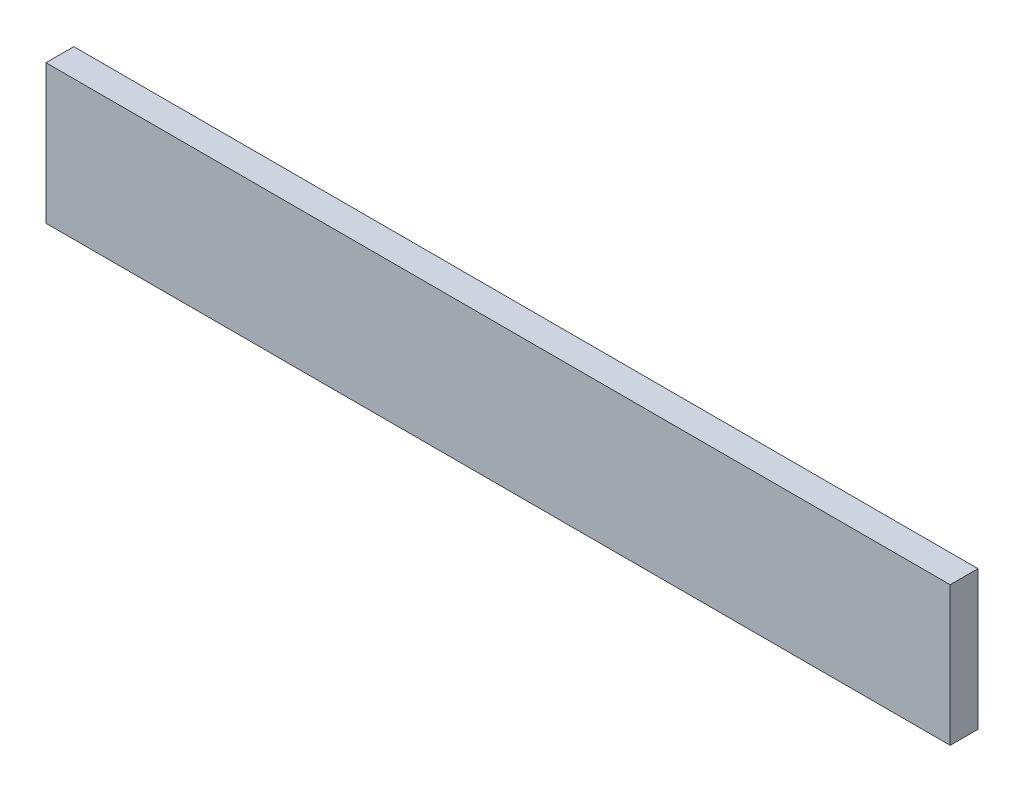
ISO-10303-21;
HEADER;
FILE_DESCRIPTION(('STEP AP214'),'2;1');
FILE_NAME('part.step','',(''),(''),'','','');
FILE_SCHEMA(('AUTOMOTIVE_DESIGN { 1 0 10303 214 1 1 1 1 }'));
ENDSEC;
DATA;
#1=APPLICATION_CONTEXT('core data for automotive mechanical design processes');
#2=APPLICATION_PROTOCOL_DEFINITION('international standard','automotive_design',2000,#1);
#3=PRODUCT_CONTEXT('',#1,'mechanical');
#4=PRODUCT('Part','Part','',(#3));
#5=PRODUCT_RELATED_PRODUCT_CATEGORY('part','',(#4));
#6=PRODUCT_DEFINITION_FORMATION('','',#4);
#7=PRODUCT_DEFINITION_CONTEXT('part definition',#1,'design');
#8=PRODUCT_DEFINITION('design','',#6,#7);
#9=PRODUCT_DEFINITION_SHAPE('','',#8);
#10=(LENGTH_UNIT() NAMED_UNIT(*) SI_UNIT(.MILLI.,.METRE.));
#11=(NAMED_UNIT(*) PLANE_ANGLE_UNIT() SI_UNIT($,.RADIAN.));
#12=(NAMED_UNIT(*) SI_UNIT($,.STERADIAN.) SOLID_ANGLE_UNIT());
#13=UNCERTAINTY_MEASURE_WITH_UNIT(LENGTH_MEASURE(1.E-05),#10,'distance_accuracy_value','');
#14=(GEOMETRIC_REPRESENTATION_CONTEXT(3) GLOBAL_UNCERTAINTY_ASSIGNED_CONTEXT((#13)) GLOBAL_UNIT_ASSIGNED_CONTEXT((#10,
#11,#12)) REPRESENTATION_CONTEXT('',''));
#15=CARTESIAN_POINT('',(0.,0.,0.));
#16=DIRECTION('',(0.,0.,1.));
#17=DIRECTION('',(1.,0.,0.));
#18=AXIS2_PLACEMENT_3D('',#15,#16,#17);
#19=CARTESIAN_POINT('',(0.,0.,2.54));
#20=DIRECTION('',(1.,0.,0.));
#21=DIRECTION('',(0.,0.,-1.));
#22=AXIS2_PLACEMENT_3D('',#19,#20,#21);
#23=PLANE('',#22);
#24=DIRECTION('',(0.,-1.,0.));
#25=VECTOR('',#24,1.);
#26=CARTESIAN_POINT('',(0.,0.,-2.54));
#27=LINE('',#26,#25);
#28=CARTESIAN_POINT('',(0.,25.4,-2.54));
#29=VERTEX_POINT('',#28);
#30=CARTESIAN_POINT('',(0.,0.,-2.54));
#31=VERTEX_POINT('',#30);
#32=EDGE_CURVE('E100',#29,#31,#27,.T.);
#33=ORIENTED_EDGE('',*,*,#32,.T.);
#34=DIRECTION('',(0.,0.,-1.));
#35=VECTOR('',#34,1.);
#36=CARTESIAN_POINT('',(0.,0.,2.54));
#37=LINE('',#36,#35);
#38=CARTESIAN_POINT('',(0.,0.,2.54));
#39=VERTEX_POINT('',#38);
#40=EDGE_CURVE('E11',#39,#31,#37,.T.);
#41=ORIENTED_EDGE('',*,*,#40,.F.);
#42=DIRECTION('',(0.,-1.,0.));
#43=VECTOR('',#42,1.);
#44=CARTESIAN_POINT('',(0.,0.,2.54));
#45=LINE('',#44,#43);
#46=CARTESIAN_POINT('',(0.,25.4,2.54));
#47=VERTEX_POINT('',#46);
#48=EDGE_CURVE('E88',#47,#39,#45,.T.);
#49=ORIENTED_EDGE('',*,*,#48,.F.);
#50=DIRECTION('',(0.,0.,-1.));
#51=VECTOR('',#50,1.);
#52=CARTESIAN_POINT('',(0.,25.4,2.54));
#53=LINE('',#52,#51);
#54=EDGE_CURVE('E96',#47,#29,#53,.T.);
#55=ORIENTED_EDGE('',*,*,#54,.T.);
#56=EDGE_LOOP('',(#33,#41,#49,#55));
#57=FACE_BOUND('',#56,.T.);
#58=ADVANCED_FACE('F37',(#57),#23,.F.);
#59=CARTESIAN_POINT('',(0.,0.,2.54));
#60=DIRECTION('',(0.,1.,0.));
#61=DIRECTION('',(0.,0.,1.));
#62=AXIS2_PLACEMENT_3D('',#59,#60,#61);
#63=PLANE('',#62);
#64=DIRECTION('',(1.,0.,0.));
#65=VECTOR('',#64,1.);
#66=CARTESIAN_POINT('',(0.,0.,-2.54));
#67=LINE('',#66,#65);
#68=CARTESIAN_POINT('',(165.1,0.,-2.54));
#69=VERTEX_POINT('',#68);
#70=EDGE_CURVE('E92',#31,#69,#67,.T.);
#71=ORIENTED_EDGE('',*,*,#70,.T.);
#72=DIRECTION('',(0.,0.,-1.));
#73=VECTOR('',#72,1.);
#74=CARTESIAN_POINT('',(165.1,0.,2.54));
#75=LINE('',#74,#73);
#76=CARTESIAN_POINT('',(165.1,0.,2.54));
#77=VERTEX_POINT('',#76);
#78=EDGE_CURVE('E45',#77,#69,#75,.T.);
#79=ORIENTED_EDGE('',*,*,#78,.F.);
#80=DIRECTION('',(1.,0.,0.));
#81=VECTOR('',#80,1.);
#82=CARTESIAN_POINT('',(0.,0.,2.54));
#83=LINE('',#82,#81);
#84=EDGE_CURVE('E83',#39,#77,#83,.T.);
#85=ORIENTED_EDGE('',*,*,#84,.F.);
#86=ORIENTED_EDGE('',*,*,#40,.T.);
#87=EDGE_LOOP('',(#71,#79,#85,#86));
#88=FACE_BOUND('',#87,.T.);
#89=ADVANCED_FACE('F91',(#88),#63,.F.);
#90=CARTESIAN_POINT('',(165.1,0.,2.54));
#91=DIRECTION('',(-1.,0.,0.));
#92=DIRECTION('',(0.,0.,1.));
#93=AXIS2_PLACEMENT_3D('',#90,#91,#92);
#94=PLANE('',#93);
#95=DIRECTION('',(0.,1.,0.));
#96=VECTOR('',#95,1.);
#97=CARTESIAN_POINT('',(165.1,0.,-2.54));
#98=LINE('',#97,#96);
#99=CARTESIAN_POINT('',(165.1,25.4,-2.54));
#100=VERTEX_POINT('',#99);
#101=EDGE_CURVE('E70',#69,#100,#98,.T.);
#102=ORIENTED_EDGE('',*,*,#101,.T.);
#103=DIRECTION('',(0.,0.,-1.));
#104=VECTOR('',#103,1.);
#105=CARTESIAN_POINT('',(165.1,25.4,2.54));
#106=LINE('',#105,#104);
#107=CARTESIAN_POINT('',(165.1,25.4,2.54));
#108=VERTEX_POINT('',#107);
#109=EDGE_CURVE('E93',#108,#100,#106,.T.);
#110=ORIENTED_EDGE('',*,*,#109,.F.);
#111=DIRECTION('',(0.,1.,0.));
#112=VECTOR('',#111,1.);
#113=CARTESIAN_POINT('',(165.1,0.,2.54));
#114=LINE('',#113,#112);
#115=EDGE_CURVE('E86',#77,#108,#114,.T.);
#116=ORIENTED_EDGE('',*,*,#115,.F.);
#117=ORIENTED_EDGE('',*,*,#78,.T.);
#118=EDGE_LOOP('',(#102,#110,#116,#117));
#119=FACE_BOUND('',#118,.T.);
#120=ADVANCED_FACE('F94',(#119),#94,.F.);
#121=CARTESIAN_POINT('',(0.,25.4,2.54));
#122=DIRECTION('',(0.,-1.,0.));
#123=DIRECTION('',(0.,0.,-1.));
#124=AXIS2_PLACEMENT_3D('',#121,#122,#123);
#125=PLANE('',#124);
#126=DIRECTION('',(-1.,0.,0.));
#127=VECTOR('',#126,1.);
#128=CARTESIAN_POINT('',(0.,25.4,-2.54));
#129=LINE('',#128,#127);
#130=EDGE_CURVE('E76',#100,#29,#129,.T.);
#131=ORIENTED_EDGE('',*,*,#130,.T.);
#132=ORIENTED_EDGE('',*,*,#54,.F.);
#133=DIRECTION('',(-1.,0.,0.));
#134=VECTOR('',#133,1.);
#135=CARTESIAN_POINT('',(0.,25.4,2.54));
#136=LINE('',#135,#134);
#137=EDGE_CURVE('E53',#108,#47,#136,.T.);
#138=ORIENTED_EDGE('',*,*,#137,.F.);
#139=ORIENTED_EDGE('',*,*,#109,.T.);
#140=EDGE_LOOP('',(#131,#132,#138,#139));
#141=FACE_BOUND('',#140,.T.);
#142=ADVANCED_FACE('F107',(#141),#125,.F.);
#143=CARTESIAN_POINT('',(0.,25.4,2.54));
#144=DIRECTION('',(0.,0.,-1.));
#145=DIRECTION('',(-1.,0.,0.));
#146=AXIS2_PLACEMENT_3D('',#143,#144,#145);
#147=PLANE('',#146);
#148=ORIENTED_EDGE('',*,*,#48,.T.);
#149=ORIENTED_EDGE('',*,*,#84,.T.);
#150=ORIENTED_EDGE('',*,*,#115,.T.);
#151=ORIENTED_EDGE('',*,*,#137,.T.);
#152=EDGE_LOOP('',(#148,#149,#150,#151));
#153=FACE_BOUND('',#152,.T.);
#154=ADVANCED_FACE('F84',(#153),#147,.F.);
#155=CARTESIAN_POINT('',(0.,25.4,-2.54));
#156=DIRECTION('',(0.,0.,-1.));
#157=DIRECTION('',(-1.,0.,0.));
#158=AXIS2_PLACEMENT_3D('',#155,#156,#157);
#159=PLANE('',#158);
#160=ORIENTED_EDGE('',*,*,#32,.F.);
#161=ORIENTED_EDGE('',*,*,#130,.F.);
#162=ORIENTED_EDGE('',*,*,#101,.F.);
#163=ORIENTED_EDGE('',*,*,#70,.F.);
#164=EDGE_LOOP('',(#160,#161,#162,#163));
#165=FACE_BOUND('',#164,.T.);
#166=ADVANCED_FACE('F110',(#165),#159,.T.);
#167=CLOSED_SHELL('',(#58,#89,#120,#142,#154,#166));
#168=MANIFOLD_SOLID_BREP('B2',#167);
#169=ADVANCED_BREP_SHAPE_REPRESENTATION('',(#18,#168),#14);
#170=SHAPE_DEFINITION_REPRESENTATION(#9,#169);
ENDSEC;
END-ISO-10303-21;
